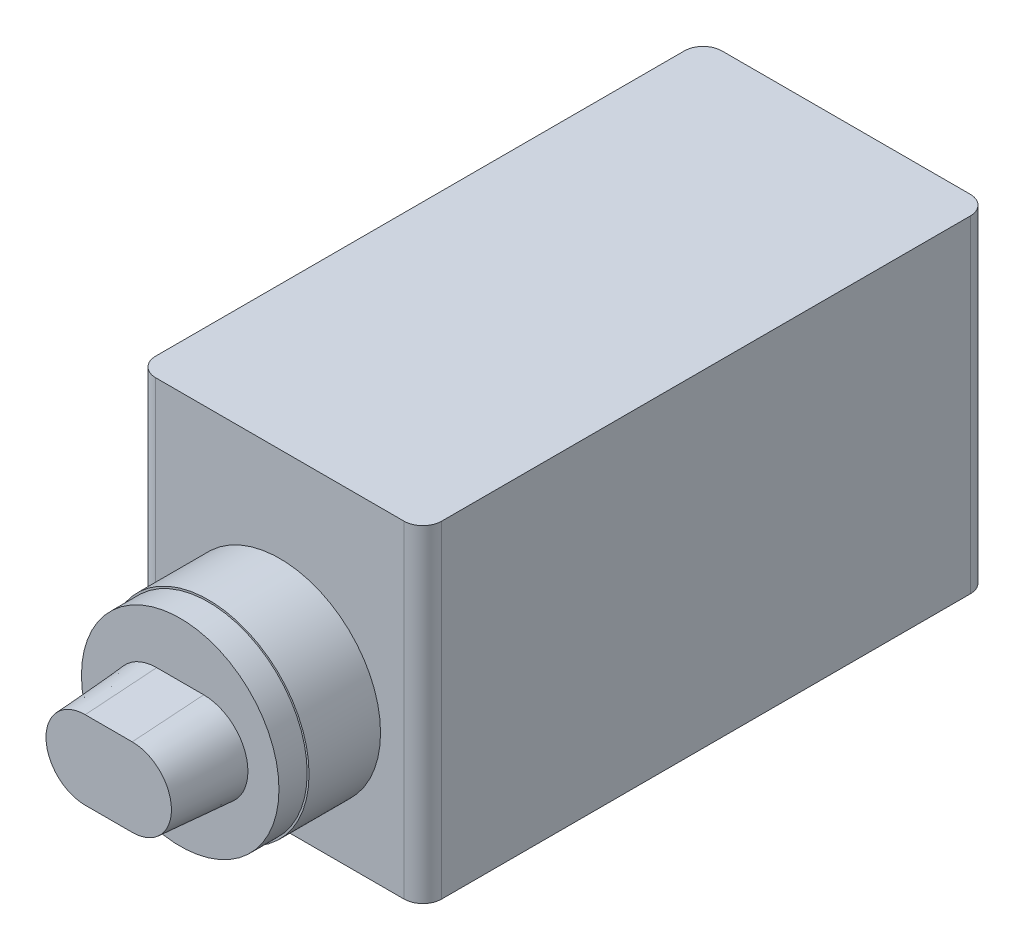
ISO-10303-21;
HEADER;
FILE_DESCRIPTION(('STEP AP214'),'2;1');
FILE_NAME('part.step','',(''),(''),'','','');
FILE_SCHEMA(('AUTOMOTIVE_DESIGN { 1 0 10303 214 1 1 1 1 }'));
ENDSEC;
DATA;
#1=APPLICATION_CONTEXT('core data for automotive mechanical design processes');
#2=APPLICATION_PROTOCOL_DEFINITION('international standard','automotive_design',2000,#1);
#3=PRODUCT_CONTEXT('',#1,'mechanical');
#4=PRODUCT('Part','Part','',(#3));
#5=PRODUCT_RELATED_PRODUCT_CATEGORY('part','',(#4));
#6=PRODUCT_DEFINITION_FORMATION('','',#4);
#7=PRODUCT_DEFINITION_CONTEXT('part definition',#1,'design');
#8=PRODUCT_DEFINITION('design','',#6,#7);
#9=PRODUCT_DEFINITION_SHAPE('','',#8);
#10=(LENGTH_UNIT() NAMED_UNIT(*) SI_UNIT(.MILLI.,.METRE.));
#11=(NAMED_UNIT(*) PLANE_ANGLE_UNIT() SI_UNIT($,.RADIAN.));
#12=(NAMED_UNIT(*) SI_UNIT($,.STERADIAN.) SOLID_ANGLE_UNIT());
#13=UNCERTAINTY_MEASURE_WITH_UNIT(LENGTH_MEASURE(1.E-05),#10,'distance_accuracy_value','');
#14=(GEOMETRIC_REPRESENTATION_CONTEXT(3) GLOBAL_UNCERTAINTY_ASSIGNED_CONTEXT((#13)) GLOBAL_UNIT_ASSIGNED_CONTEXT((#10,
#11,#12)) REPRESENTATION_CONTEXT('',''));
#15=CARTESIAN_POINT('',(0.,0.,0.));
#16=DIRECTION('',(0.,0.,1.));
#17=DIRECTION('',(1.,0.,0.));
#18=AXIS2_PLACEMENT_3D('',#15,#16,#17);
#19=CARTESIAN_POINT('',(0.,7.03074551830696,20.35));
#20=DIRECTION('',(0.,0.,1.));
#21=DIRECTION('',(1.,0.,0.));
#22=AXIS2_PLACEMENT_3D('',#19,#20,#21);
#23=PLANE('',#22);
#24=CARTESIAN_POINT('',(0.,7.03074551830696,20.35));
#25=DIRECTION('',(0.,0.,1.));
#26=DIRECTION('',(1.,0.,0.));
#27=AXIS2_PLACEMENT_3D('',#24,#25,#26);
#28=CIRCLE('',#27,5.25);
#29=CARTESIAN_POINT('',(5.25,7.03074551830696,20.35));
#30=VERTEX_POINT('',#29);
#31=EDGE_CURVE('E169',#30,#30,#28,.T.);
#32=ORIENTED_EDGE('',*,*,#31,.T.);
#33=EDGE_LOOP('',(#32));
#34=FACE_BOUND('',#33,.T.);
#35=DIRECTION('',(1.,0.,0.));
#36=VECTOR('',#35,1.);
#37=CARTESIAN_POINT('',(-1.25,4.68074551830696,20.35));
#38=LINE('',#37,#36);
#39=CARTESIAN_POINT('',(-1.25,4.68074551830696,20.35));
#40=VERTEX_POINT('',#39);
#41=CARTESIAN_POINT('',(1.25,4.68074551830696,20.35));
#42=VERTEX_POINT('',#41);
#43=EDGE_CURVE('E134',#40,#42,#38,.T.);
#44=ORIENTED_EDGE('',*,*,#43,.F.);
#45=CARTESIAN_POINT('',(-1.25,7.03074551830696,20.35));
#46=DIRECTION('',(0.,0.,1.));
#47=DIRECTION('',(1.,0.,0.));
#48=AXIS2_PLACEMENT_3D('',#45,#46,#47);
#49=CIRCLE('',#48,2.35);
#50=CARTESIAN_POINT('',(-1.25,9.38074551830696,20.35));
#51=VERTEX_POINT('',#50);
#52=EDGE_CURVE('E145',#51,#40,#49,.T.);
#53=ORIENTED_EDGE('',*,*,#52,.F.);
#54=DIRECTION('',(-1.,0.,0.));
#55=VECTOR('',#54,1.);
#56=CARTESIAN_POINT('',(-1.25,9.38074551830696,20.35));
#57=LINE('',#56,#55);
#58=CARTESIAN_POINT('',(1.25,9.38074551830696,20.35));
#59=VERTEX_POINT('',#58);
#60=EDGE_CURVE('E155',#59,#51,#57,.T.);
#61=ORIENTED_EDGE('',*,*,#60,.F.);
#62=CARTESIAN_POINT('',(1.25,7.03074551830696,20.35));
#63=DIRECTION('',(0.,0.,1.));
#64=DIRECTION('',(1.,0.,0.));
#65=AXIS2_PLACEMENT_3D('',#62,#63,#64);
#66=CIRCLE('',#65,2.35);
#67=EDGE_CURVE('E153',#42,#59,#66,.T.);
#68=ORIENTED_EDGE('',*,*,#67,.F.);
#69=EDGE_LOOP('',(#44,#53,#61,#68));
#70=FACE_BOUND('',#69,.T.);
#71=ADVANCED_FACE('F38',(#34,#70),#23,.T.);
#72=CARTESIAN_POINT('',(0.,7.03074551830696,18.85));
#73=DIRECTION('',(0.,0.,1.));
#74=DIRECTION('',(1.,0.,0.));
#75=AXIS2_PLACEMENT_3D('',#72,#73,#74);
#76=PLANE('',#75);
#77=CARTESIAN_POINT('',(0.,7.03074551830696,18.85));
#78=DIRECTION('',(0.,0.,1.));
#79=DIRECTION('',(1.,0.,0.));
#80=AXIS2_PLACEMENT_3D('',#77,#78,#79);
#81=CIRCLE('',#80,5.35);
#82=CARTESIAN_POINT('',(-5.35,7.03074551830696,18.85));
#83=VERTEX_POINT('',#82);
#84=EDGE_CURVE('E172',#83,#83,#81,.T.);
#85=ORIENTED_EDGE('',*,*,#84,.T.);
#86=EDGE_LOOP('',(#85));
#87=FACE_BOUND('',#86,.T.);
#88=CARTESIAN_POINT('',(0.,7.03074551830696,18.85));
#89=DIRECTION('',(0.,0.,1.));
#90=DIRECTION('',(1.,0.,0.));
#91=AXIS2_PLACEMENT_3D('',#88,#89,#90);
#92=CIRCLE('',#91,5.25);
#93=CARTESIAN_POINT('',(5.25,7.03074551830696,18.85));
#94=VERTEX_POINT('',#93);
#95=EDGE_CURVE('E140',#94,#94,#92,.T.);
#96=ORIENTED_EDGE('',*,*,#95,.F.);
#97=EDGE_LOOP('',(#96));
#98=FACE_BOUND('',#97,.T.);
#99=ADVANCED_FACE('F276',(#87,#98),#76,.T.);
#100=CARTESIAN_POINT('',(7.6,17.4,15.05));
#101=DIRECTION('',(0.,0.,-1.));
#102=DIRECTION('',(-1.,0.,0.));
#103=AXIS2_PLACEMENT_3D('',#100,#101,#102);
#104=PLANE('',#103);
#105=DIRECTION('',(1.,0.,0.));
#106=VECTOR('',#105,1.);
#107=CARTESIAN_POINT('',(7.6,17.4,15.05));
#108=LINE('',#107,#106);
#109=CARTESIAN_POINT('',(-6.6,17.4,15.05));
#110=VERTEX_POINT('',#109);
#111=CARTESIAN_POINT('',(6.6,17.4,15.05));
#112=VERTEX_POINT('',#111);
#113=EDGE_CURVE('E181',#110,#112,#108,.T.);
#114=ORIENTED_EDGE('',*,*,#113,.F.);
#115=DIRECTION('',(0.,-1.,0.));
#116=VECTOR('',#115,1.);
#117=CARTESIAN_POINT('',(-6.6,17.4,15.05));
#118=LINE('',#117,#116);
#119=CARTESIAN_POINT('',(-6.6,0.,15.05));
#120=VERTEX_POINT('',#119);
#121=EDGE_CURVE('E46',#110,#120,#118,.T.);
#122=ORIENTED_EDGE('',*,*,#121,.T.);
#123=DIRECTION('',(1.,0.,0.));
#124=VECTOR('',#123,1.);
#125=CARTESIAN_POINT('',(7.6,0.,15.05));
#126=LINE('',#125,#124);
#127=CARTESIAN_POINT('',(6.6,0.,15.05));
#128=VERTEX_POINT('',#127);
#129=EDGE_CURVE('E193',#120,#128,#126,.T.);
#130=ORIENTED_EDGE('',*,*,#129,.T.);
#131=DIRECTION('',(0.,-1.,0.));
#132=VECTOR('',#131,1.);
#133=CARTESIAN_POINT('',(6.6,17.4,15.05));
#134=LINE('',#133,#132);
#135=EDGE_CURVE('E229',#128,#112,#134,.F.);
#136=ORIENTED_EDGE('',*,*,#135,.T.);
#137=EDGE_LOOP('',(#114,#122,#130,#136));
#138=FACE_BOUND('',#137,.T.);
#139=CARTESIAN_POINT('',(0.,7.03074551830696,15.05));
#140=DIRECTION('',(0.,0.,-1.));
#141=DIRECTION('',(-1.,0.,0.));
#142=AXIS2_PLACEMENT_3D('',#139,#140,#141);
#143=CIRCLE('',#142,5.35);
#144=CARTESIAN_POINT('',(-5.35,7.03074551830696,15.05));
#145=VERTEX_POINT('',#144);
#146=EDGE_CURVE('E11',#145,#145,#143,.F.);
#147=ORIENTED_EDGE('',*,*,#146,.F.);
#148=EDGE_LOOP('',(#147));
#149=FACE_BOUND('',#148,.T.);
#150=ADVANCED_FACE('F235',(#138,#149),#104,.F.);
#151=CARTESIAN_POINT('',(-7.6,17.4,15.05));
#152=DIRECTION('',(1.,0.,0.));
#153=DIRECTION('',(0.,0.,-1.));
#154=AXIS2_PLACEMENT_3D('',#151,#152,#153);
#155=PLANE('',#154);
#156=DIRECTION('',(0.,0.,1.));
#157=VECTOR('',#156,1.);
#158=CARTESIAN_POINT('',(-7.6,17.4,15.05));
#159=LINE('',#158,#157);
#160=CARTESIAN_POINT('',(-7.6,17.4,-14.05));
#161=VERTEX_POINT('',#160);
#162=CARTESIAN_POINT('',(-7.6,17.4,14.05));
#163=VERTEX_POINT('',#162);
#164=EDGE_CURVE('E178',#161,#163,#159,.T.);
#165=ORIENTED_EDGE('',*,*,#164,.F.);
#166=DIRECTION('',(0.,-1.,0.));
#167=VECTOR('',#166,1.);
#168=CARTESIAN_POINT('',(-7.6,17.4,-14.05));
#169=LINE('',#168,#167);
#170=CARTESIAN_POINT('',(-7.6,0.,-14.05));
#171=VERTEX_POINT('',#170);
#172=EDGE_CURVE('E201',#161,#171,#169,.T.);
#173=ORIENTED_EDGE('',*,*,#172,.T.);
#174=DIRECTION('',(0.,0.,1.));
#175=VECTOR('',#174,1.);
#176=CARTESIAN_POINT('',(-7.6,0.,15.05));
#177=LINE('',#176,#175);
#178=CARTESIAN_POINT('',(-7.6,0.,14.05));
#179=VERTEX_POINT('',#178);
#180=EDGE_CURVE('E177',#171,#179,#177,.T.);
#181=ORIENTED_EDGE('',*,*,#180,.T.);
#182=DIRECTION('',(0.,-1.,0.));
#183=VECTOR('',#182,1.);
#184=CARTESIAN_POINT('',(-7.6,17.4,14.05));
#185=LINE('',#184,#183);
#186=EDGE_CURVE('E190',#179,#163,#185,.F.);
#187=ORIENTED_EDGE('',*,*,#186,.T.);
#188=EDGE_LOOP('',(#165,#173,#181,#187));
#189=FACE_BOUND('',#188,.T.);
#190=ADVANCED_FACE('F265',(#189),#155,.F.);
#191=CARTESIAN_POINT('',(7.6,17.4,15.05));
#192=DIRECTION('',(-1.,0.,0.));
#193=DIRECTION('',(0.,0.,1.));
#194=AXIS2_PLACEMENT_3D('',#191,#192,#193);
#195=PLANE('',#194);
#196=DIRECTION('',(0.,0.,-1.));
#197=VECTOR('',#196,1.);
#198=CARTESIAN_POINT('',(7.6,0.,15.05));
#199=LINE('',#198,#197);
#200=CARTESIAN_POINT('',(7.6,0.,14.05));
#201=VERTEX_POINT('',#200);
#202=CARTESIAN_POINT('',(7.6,0.,-14.05));
#203=VERTEX_POINT('',#202);
#204=EDGE_CURVE('E196',#201,#203,#199,.T.);
#205=ORIENTED_EDGE('',*,*,#204,.T.);
#206=DIRECTION('',(0.,-1.,0.));
#207=VECTOR('',#206,1.);
#208=CARTESIAN_POINT('',(7.6,17.4,-14.05));
#209=LINE('',#208,#207);
#210=CARTESIAN_POINT('',(7.6,17.4,-14.05));
#211=VERTEX_POINT('',#210);
#212=EDGE_CURVE('E61',#203,#211,#209,.F.);
#213=ORIENTED_EDGE('',*,*,#212,.T.);
#214=DIRECTION('',(0.,0.,-1.));
#215=VECTOR('',#214,1.);
#216=CARTESIAN_POINT('',(7.6,17.4,15.05));
#217=LINE('',#216,#215);
#218=CARTESIAN_POINT('',(7.6,17.4,14.05));
#219=VERTEX_POINT('',#218);
#220=EDGE_CURVE('E185',#219,#211,#217,.T.);
#221=ORIENTED_EDGE('',*,*,#220,.F.);
#222=DIRECTION('',(0.,-1.,0.));
#223=VECTOR('',#222,1.);
#224=CARTESIAN_POINT('',(7.6,17.4,14.05));
#225=LINE('',#224,#223);
#226=EDGE_CURVE('E225',#219,#201,#225,.T.);
#227=ORIENTED_EDGE('',*,*,#226,.T.);
#228=EDGE_LOOP('',(#205,#213,#221,#227));
#229=FACE_BOUND('',#228,.T.);
#230=ADVANCED_FACE('F247',(#229),#195,.F.);
#231=CARTESIAN_POINT('',(7.6,17.4,-15.05));
#232=DIRECTION('',(0.,0.,1.));
#233=DIRECTION('',(1.,0.,0.));
#234=AXIS2_PLACEMENT_3D('',#231,#232,#233);
#235=PLANE('',#234);
#236=DIRECTION('',(-1.,0.,0.));
#237=VECTOR('',#236,1.);
#238=CARTESIAN_POINT('',(7.6,0.,-15.05));
#239=LINE('',#238,#237);
#240=CARTESIAN_POINT('',(6.6,0.,-15.05));
#241=VERTEX_POINT('',#240);
#242=CARTESIAN_POINT('',(-6.6,0.,-15.05));
#243=VERTEX_POINT('',#242);
#244=EDGE_CURVE('E182',#241,#243,#239,.T.);
#245=ORIENTED_EDGE('',*,*,#244,.T.);
#246=DIRECTION('',(0.,-1.,0.));
#247=VECTOR('',#246,1.);
#248=CARTESIAN_POINT('',(-6.6,17.4,-15.05));
#249=LINE('',#248,#247);
#250=CARTESIAN_POINT('',(-6.6,17.4,-15.05));
#251=VERTEX_POINT('',#250);
#252=EDGE_CURVE('E215',#243,#251,#249,.F.);
#253=ORIENTED_EDGE('',*,*,#252,.T.);
#254=DIRECTION('',(-1.,0.,0.));
#255=VECTOR('',#254,1.);
#256=CARTESIAN_POINT('',(7.6,17.4,-15.05));
#257=LINE('',#256,#255);
#258=CARTESIAN_POINT('',(6.6,17.4,-15.05));
#259=VERTEX_POINT('',#258);
#260=EDGE_CURVE('E187',#259,#251,#257,.T.);
#261=ORIENTED_EDGE('',*,*,#260,.F.);
#262=DIRECTION('',(0.,-1.,0.));
#263=VECTOR('',#262,1.);
#264=CARTESIAN_POINT('',(6.6,17.4,-15.05));
#265=LINE('',#264,#263);
#266=EDGE_CURVE('E212',#259,#241,#265,.T.);
#267=ORIENTED_EDGE('',*,*,#266,.T.);
#268=EDGE_LOOP('',(#245,#253,#261,#267));
#269=FACE_BOUND('',#268,.T.);
#270=ADVANCED_FACE('F257',(#269),#235,.F.);
#271=CARTESIAN_POINT('',(-7.6,17.4,-15.05));
#272=DIRECTION('',(0.,1.,0.));
#273=DIRECTION('',(0.,0.,1.));
#274=AXIS2_PLACEMENT_3D('',#271,#272,#273);
#275=PLANE('',#274);
#276=ORIENTED_EDGE('',*,*,#260,.T.);
#277=CARTESIAN_POINT('',(-6.6,17.4,-14.05));
#278=DIRECTION('',(0.,1.,0.));
#279=DIRECTION('',(0.,0.,1.));
#280=AXIS2_PLACEMENT_3D('',#277,#278,#279);
#281=CIRCLE('',#280,1.);
#282=EDGE_CURVE('E223',#251,#161,#281,.T.);
#283=ORIENTED_EDGE('',*,*,#282,.T.);
#284=ORIENTED_EDGE('',*,*,#164,.T.);
#285=CARTESIAN_POINT('',(-6.6,17.4,14.05));
#286=DIRECTION('',(0.,1.,0.));
#287=DIRECTION('',(0.,0.,1.));
#288=AXIS2_PLACEMENT_3D('',#285,#286,#287);
#289=CIRCLE('',#288,1.);
#290=EDGE_CURVE('E219',#163,#110,#289,.T.);
#291=ORIENTED_EDGE('',*,*,#290,.T.);
#292=ORIENTED_EDGE('',*,*,#113,.T.);
#293=CARTESIAN_POINT('',(6.6,17.4,14.05));
#294=DIRECTION('',(0.,1.,0.));
#295=DIRECTION('',(0.,0.,1.));
#296=AXIS2_PLACEMENT_3D('',#293,#294,#295);
#297=CIRCLE('',#296,1.);
#298=EDGE_CURVE('E217',#112,#219,#297,.T.);
#299=ORIENTED_EDGE('',*,*,#298,.T.);
#300=ORIENTED_EDGE('',*,*,#220,.T.);
#301=CARTESIAN_POINT('',(6.6,17.4,-14.05));
#302=DIRECTION('',(0.,1.,0.));
#303=DIRECTION('',(0.,0.,1.));
#304=AXIS2_PLACEMENT_3D('',#301,#302,#303);
#305=CIRCLE('',#304,1.);
#306=EDGE_CURVE('E221',#211,#259,#305,.T.);
#307=ORIENTED_EDGE('',*,*,#306,.T.);
#308=EDGE_LOOP('',(#276,#283,#284,#291,#292,#299,#300,#307));
#309=FACE_BOUND('',#308,.T.);
#310=ADVANCED_FACE('F250',(#309),#275,.T.);
#311=CARTESIAN_POINT('',(-7.6,0.,-15.05));
#312=DIRECTION('',(0.,1.,0.));
#313=DIRECTION('',(0.,0.,1.));
#314=AXIS2_PLACEMENT_3D('',#311,#312,#313);
#315=PLANE('',#314);
#316=ORIENTED_EDGE('',*,*,#180,.F.);
#317=CARTESIAN_POINT('',(-6.6,0.,-14.05));
#318=DIRECTION('',(0.,1.,0.));
#319=DIRECTION('',(0.,0.,1.));
#320=AXIS2_PLACEMENT_3D('',#317,#318,#319);
#321=CIRCLE('',#320,1.);
#322=EDGE_CURVE('E210',#171,#243,#321,.F.);
#323=ORIENTED_EDGE('',*,*,#322,.T.);
#324=ORIENTED_EDGE('',*,*,#244,.F.);
#325=CARTESIAN_POINT('',(6.6,0.,-14.05));
#326=DIRECTION('',(0.,1.,0.));
#327=DIRECTION('',(0.,0.,1.));
#328=AXIS2_PLACEMENT_3D('',#325,#326,#327);
#329=CIRCLE('',#328,1.);
#330=EDGE_CURVE('E208',#241,#203,#329,.F.);
#331=ORIENTED_EDGE('',*,*,#330,.T.);
#332=ORIENTED_EDGE('',*,*,#204,.F.);
#333=CARTESIAN_POINT('',(6.6,0.,14.05));
#334=DIRECTION('',(0.,1.,0.));
#335=DIRECTION('',(0.,0.,1.));
#336=AXIS2_PLACEMENT_3D('',#333,#334,#335);
#337=CIRCLE('',#336,1.);
#338=EDGE_CURVE('E204',#201,#128,#337,.F.);
#339=ORIENTED_EDGE('',*,*,#338,.T.);
#340=ORIENTED_EDGE('',*,*,#129,.F.);
#341=CARTESIAN_POINT('',(-6.6,0.,14.05));
#342=DIRECTION('',(0.,1.,0.));
#343=DIRECTION('',(0.,0.,1.));
#344=AXIS2_PLACEMENT_3D('',#341,#342,#343);
#345=CIRCLE('',#344,1.);
#346=EDGE_CURVE('E206',#120,#179,#345,.F.);
#347=ORIENTED_EDGE('',*,*,#346,.T.);
#348=EDGE_LOOP('',(#316,#323,#324,#331,#332,#339,#340,#347));
#349=FACE_BOUND('',#348,.T.);
#350=ADVANCED_FACE('F242',(#349),#315,.F.);
#351=CARTESIAN_POINT('',(-6.6,17.4,-14.05));
#352=DIRECTION('',(0.,-1.,0.));
#353=DIRECTION('',(0.,0.,-1.));
#354=AXIS2_PLACEMENT_3D('',#351,#352,#353);
#355=CYLINDRICAL_SURFACE('',#354,1.);
#356=ORIENTED_EDGE('',*,*,#282,.F.);
#357=ORIENTED_EDGE('',*,*,#252,.F.);
#358=ORIENTED_EDGE('',*,*,#322,.F.);
#359=ORIENTED_EDGE('',*,*,#172,.F.);
#360=EDGE_LOOP('',(#356,#357,#358,#359));
#361=FACE_BOUND('',#360,.T.);
#362=ADVANCED_FACE('F262',(#361),#355,.T.);
#363=CARTESIAN_POINT('',(6.6,17.4,-14.05));
#364=DIRECTION('',(0.,-1.,0.));
#365=DIRECTION('',(0.,0.,-1.));
#366=AXIS2_PLACEMENT_3D('',#363,#364,#365);
#367=CYLINDRICAL_SURFACE('',#366,1.);
#368=ORIENTED_EDGE('',*,*,#306,.F.);
#369=ORIENTED_EDGE('',*,*,#212,.F.);
#370=ORIENTED_EDGE('',*,*,#330,.F.);
#371=ORIENTED_EDGE('',*,*,#266,.F.);
#372=EDGE_LOOP('',(#368,#369,#370,#371));
#373=FACE_BOUND('',#372,.T.);
#374=ADVANCED_FACE('F254',(#373),#367,.T.);
#375=CARTESIAN_POINT('',(-6.6,17.4,14.05));
#376=DIRECTION('',(0.,-1.,0.));
#377=DIRECTION('',(0.,0.,-1.));
#378=AXIS2_PLACEMENT_3D('',#375,#376,#377);
#379=CYLINDRICAL_SURFACE('',#378,1.);
#380=ORIENTED_EDGE('',*,*,#290,.F.);
#381=ORIENTED_EDGE('',*,*,#186,.F.);
#382=ORIENTED_EDGE('',*,*,#346,.F.);
#383=ORIENTED_EDGE('',*,*,#121,.F.);
#384=EDGE_LOOP('',(#380,#381,#382,#383));
#385=FACE_BOUND('',#384,.T.);
#386=ADVANCED_FACE('F267',(#385),#379,.T.);
#387=CARTESIAN_POINT('',(6.6,17.4,14.05));
#388=DIRECTION('',(0.,-1.,0.));
#389=DIRECTION('',(0.,0.,-1.));
#390=AXIS2_PLACEMENT_3D('',#387,#388,#389);
#391=CYLINDRICAL_SURFACE('',#390,1.);
#392=ORIENTED_EDGE('',*,*,#298,.F.);
#393=ORIENTED_EDGE('',*,*,#135,.F.);
#394=ORIENTED_EDGE('',*,*,#338,.F.);
#395=ORIENTED_EDGE('',*,*,#226,.F.);
#396=EDGE_LOOP('',(#392,#393,#394,#395));
#397=FACE_BOUND('',#396,.T.);
#398=ADVANCED_FACE('F40',(#397),#391,.T.);
#399=CARTESIAN_POINT('',(0.,7.03074551830696,18.85));
#400=DIRECTION('',(0.,0.,-1.));
#401=DIRECTION('',(-1.,0.,0.));
#402=AXIS2_PLACEMENT_3D('',#399,#400,#401);
#403=CYLINDRICAL_SURFACE('',#402,5.35);
#404=CARTESIAN_POINT('',(-5.35,7.03074551830696,18.85));
#405=CARTESIAN_POINT('',(-5.35,7.03074551830696,18.8104166666667));
#406=CARTESIAN_POINT('',(-5.35,7.03074551830696,18.7708333333333));
#407=CARTESIAN_POINT('',(-5.35,7.03074551830696,18.6916666666667));
#408=CARTESIAN_POINT('',(-5.35,7.03074551830696,18.6520833333333));
#409=CARTESIAN_POINT('',(-5.35,7.03074551830696,18.5729166666667));
#410=CARTESIAN_POINT('',(-5.35,7.03074551830696,18.5333333333333));
#411=CARTESIAN_POINT('',(-5.35,7.03074551830696,18.4541666666667));
#412=CARTESIAN_POINT('',(-5.35,7.03074551830696,18.4145833333333));
#413=CARTESIAN_POINT('',(-5.35,7.03074551830696,18.3354166666667));
#414=CARTESIAN_POINT('',(-5.35,7.03074551830696,18.2958333333333));
#415=CARTESIAN_POINT('',(-5.35,7.03074551830696,18.2166666666667));
#416=CARTESIAN_POINT('',(-5.35,7.03074551830696,18.1770833333333));
#417=CARTESIAN_POINT('',(-5.35,7.03074551830696,18.0979166666667));
#418=CARTESIAN_POINT('',(-5.35,7.03074551830696,18.0583333333333));
#419=CARTESIAN_POINT('',(-5.35,7.03074551830696,17.9791666666667));
#420=CARTESIAN_POINT('',(-5.35,7.03074551830696,17.9395833333333));
#421=CARTESIAN_POINT('',(-5.35,7.03074551830696,17.8604166666667));
#422=CARTESIAN_POINT('',(-5.35,7.03074551830696,17.8208333333333));
#423=CARTESIAN_POINT('',(-5.35,7.03074551830696,17.7416666666667));
#424=CARTESIAN_POINT('',(-5.35,7.03074551830696,17.7020833333333));
#425=CARTESIAN_POINT('',(-5.35,7.03074551830696,17.6229166666667));
#426=CARTESIAN_POINT('',(-5.35,7.03074551830696,17.5833333333333));
#427=CARTESIAN_POINT('',(-5.35,7.03074551830696,17.5041666666667));
#428=CARTESIAN_POINT('',(-5.35,7.03074551830696,17.4645833333333));
#429=CARTESIAN_POINT('',(-5.35,7.03074551830696,17.3854166666667));
#430=CARTESIAN_POINT('',(-5.35,7.03074551830696,17.3458333333333));
#431=CARTESIAN_POINT('',(-5.35,7.03074551830696,17.2666666666667));
#432=CARTESIAN_POINT('',(-5.35,7.03074551830696,17.2270833333333));
#433=CARTESIAN_POINT('',(-5.35,7.03074551830696,17.1479166666667));
#434=CARTESIAN_POINT('',(-5.35,7.03074551830696,17.1083333333333));
#435=CARTESIAN_POINT('',(-5.35,7.03074551830696,17.0291666666667));
#436=CARTESIAN_POINT('',(-5.35,7.03074551830696,16.9895833333333));
#437=CARTESIAN_POINT('',(-5.35,7.03074551830696,16.9104166666667));
#438=CARTESIAN_POINT('',(-5.35,7.03074551830696,16.8708333333333));
#439=CARTESIAN_POINT('',(-5.35,7.03074551830696,16.7916666666667));
#440=CARTESIAN_POINT('',(-5.35,7.03074551830696,16.7520833333333));
#441=CARTESIAN_POINT('',(-5.35,7.03074551830696,16.6729166666667));
#442=CARTESIAN_POINT('',(-5.35,7.03074551830696,16.6333333333333));
#443=CARTESIAN_POINT('',(-5.35,7.03074551830696,16.5541666666667));
#444=CARTESIAN_POINT('',(-5.35,7.03074551830696,16.5145833333333));
#445=CARTESIAN_POINT('',(-5.35,7.03074551830696,16.4354166666667));
#446=CARTESIAN_POINT('',(-5.35,7.03074551830696,16.3958333333333));
#447=CARTESIAN_POINT('',(-5.35,7.03074551830696,16.3166666666667));
#448=CARTESIAN_POINT('',(-5.35,7.03074551830696,16.2770833333333));
#449=CARTESIAN_POINT('',(-5.35,7.03074551830696,16.1979166666667));
#450=CARTESIAN_POINT('',(-5.35,7.03074551830696,16.1583333333333));
#451=CARTESIAN_POINT('',(-5.35,7.03074551830696,16.0791666666667));
#452=CARTESIAN_POINT('',(-5.35,7.03074551830696,16.0395833333333));
#453=CARTESIAN_POINT('',(-5.35,7.03074551830696,15.9604166666667));
#454=CARTESIAN_POINT('',(-5.35,7.03074551830696,15.9208333333333));
#455=CARTESIAN_POINT('',(-5.35,7.03074551830696,15.8416666666667));
#456=CARTESIAN_POINT('',(-5.35,7.03074551830696,15.8020833333333));
#457=CARTESIAN_POINT('',(-5.35,7.03074551830696,15.7229166666667));
#458=CARTESIAN_POINT('',(-5.35,7.03074551830696,15.6833333333333));
#459=CARTESIAN_POINT('',(-5.35,7.03074551830696,15.6041666666667));
#460=CARTESIAN_POINT('',(-5.35,7.03074551830696,15.5645833333333));
#461=CARTESIAN_POINT('',(-5.35,7.03074551830696,15.4854166666667));
#462=CARTESIAN_POINT('',(-5.35,7.03074551830696,15.4458333333333));
#463=CARTESIAN_POINT('',(-5.35,7.03074551830696,15.3666666666667));
#464=CARTESIAN_POINT('',(-5.35,7.03074551830696,15.3270833333333));
#465=CARTESIAN_POINT('',(-5.35,7.03074551830696,15.2479166666667));
#466=CARTESIAN_POINT('',(-5.35,7.03074551830696,15.2083333333333));
#467=CARTESIAN_POINT('',(-5.35,7.03074551830696,15.1291666666667));
#468=CARTESIAN_POINT('',(-5.35,7.03074551830696,15.0895833333333));
#469=CARTESIAN_POINT('',(-5.35,7.03074551830696,15.05));
#470=B_SPLINE_CURVE_WITH_KNOTS('',3,(#404,#405,#406,#407,#408,#409,#410,#411,#412,#413,#414,
#415,#416,#417,#418,#419,#420,#421,#422,#423,#424,#425,#426,#427,#428,#429,#430,#431,#432,#433,
#434,#435,#436,#437,#438,#439,#440,#441,#442,#443,#444,#445,#446,#447,#448,#449,#450,#451,#452,
#453,#454,#455,#456,#457,#458,#459,#460,#461,#462,#463,#464,#465,#466,#467,#468,#469),
.UNSPECIFIED.,.F.,.F.,(4,2,2,2,2,2,2,2,2,2,2,2,2,2,2,2,2,2,2,2,2,2,2,2,2,2,2,2,2,2,2,2,4),(0.,
0.118750000000001,0.237500000000002,0.356250000000002,0.475000000000003,0.593750000000001,
0.712500000000001,0.831250000000002,0.950000000000003,1.06875,1.1875,1.30625,1.425,1.54375,
1.6625,1.78125,1.9,2.01875,2.1375,2.25625,2.375,2.49375,2.6125,2.73125,2.85,2.96875,3.0875,
3.20625,3.325,3.44375,3.5625,3.68125,3.8),.UNSPECIFIED.);
#471=EDGE_CURVE('BSEAM273',#83,#145,#470,.T.);
#472=ORIENTED_EDGE('',*,*,#84,.F.);
#473=ORIENTED_EDGE('',*,*,#146,.T.);
#474=ORIENTED_EDGE('',*,*,#471,.T.);
#475=ORIENTED_EDGE('',*,*,#471,.F.);
#476=EDGE_LOOP('',(#472,#474,#473,#475));
#477=FACE_BOUND('',#476,.T.);
#478=ADVANCED_FACE('F273',(#477),#403,.T.);
#479=CARTESIAN_POINT('',(0.,7.03074551830696,20.35));
#480=DIRECTION('',(0.,0.,-1.));
#481=DIRECTION('',(-1.,0.,0.));
#482=AXIS2_PLACEMENT_3D('',#479,#480,#481);
#483=CYLINDRICAL_SURFACE('',#482,5.25);
#484=ORIENTED_EDGE('',*,*,#31,.F.);
#485=EDGE_LOOP('',(#484));
#486=FACE_BOUND('',#485,.T.);
#487=ORIENTED_EDGE('',*,*,#95,.T.);
#488=EDGE_LOOP('',(#487));
#489=FACE_BOUND('',#488,.T.);
#490=ADVANCED_FACE('F287',(#486,#489),#483,.T.);
#491=CARTESIAN_POINT('',(-1.25,7.03074551830696,20.35));
#492=DIRECTION('',(0.,0.,-1.));
#493=DIRECTION('',(1.,0.,0.));
#494=AXIS2_PLACEMENT_3D('',#491,#492,#493);
#495=CONICAL_SURFACE('',#494,2.35,0.0698131700797733);
#496=ORIENTED_EDGE('',*,*,#52,.T.);
#497=DIRECTION('',(0.,-0.0697564737441255,-0.997564050259824));
#498=VECTOR('',#497,1.);
#499=CARTESIAN_POINT('',(-1.25,4.68074551830696,20.35));
#500=LINE('',#499,#498);
#501=CARTESIAN_POINT('',(-1.25,4.9464674036923,24.15));
#502=VERTEX_POINT('',#501);
#503=EDGE_CURVE('E129',#502,#40,#500,.T.);
#504=ORIENTED_EDGE('',*,*,#503,.F.);
#505=CARTESIAN_POINT('',(-1.25,7.03074551830696,24.15));
#506=DIRECTION('',(0.,0.,1.));
#507=DIRECTION('',(1.,0.,0.));
#508=AXIS2_PLACEMENT_3D('',#505,#506,#507);
#509=CIRCLE('',#508,2.08427811461466);
#510=CARTESIAN_POINT('',(-1.25,9.11502363292162,24.15));
#511=VERTEX_POINT('',#510);
#512=EDGE_CURVE('E158',#511,#502,#509,.T.);
#513=ORIENTED_EDGE('',*,*,#512,.F.);
#514=DIRECTION('',(0.,0.0697564737441255,-0.997564050259824));
#515=VECTOR('',#514,1.);
#516=CARTESIAN_POINT('',(-1.25,9.38074551830696,20.35));
#517=LINE('',#516,#515);
#518=EDGE_CURVE('E148',#511,#51,#517,.T.);
#519=ORIENTED_EDGE('',*,*,#518,.T.);
#520=EDGE_LOOP('',(#496,#504,#513,#519));
#521=FACE_BOUND('',#520,.T.);
#522=ADVANCED_FACE('F146',(#521),#495,.T.);
#523=CARTESIAN_POINT('',(-1.25,4.68074551830696,20.35));
#524=DIRECTION('',(0.,-0.997564050259824,0.0697564737441255));
#525=DIRECTION('',(0.,-0.0697564737441255,-0.997564050259824));
#526=AXIS2_PLACEMENT_3D('',#523,#524,#525);
#527=PLANE('',#526);
#528=ORIENTED_EDGE('',*,*,#43,.T.);
#529=DIRECTION('',(0.,-0.0697564737441255,-0.997564050259824));
#530=VECTOR('',#529,1.);
#531=CARTESIAN_POINT('',(1.25,4.68074551830696,20.35));
#532=LINE('',#531,#530);
#533=CARTESIAN_POINT('',(1.25,4.9464674036923,24.15));
#534=VERTEX_POINT('',#533);
#535=EDGE_CURVE('E141',#534,#42,#532,.T.);
#536=ORIENTED_EDGE('',*,*,#535,.F.);
#537=DIRECTION('',(-1.,0.,0.));
#538=VECTOR('',#537,1.);
#539=CARTESIAN_POINT('',(-1.25,4.9464674036923,24.15));
#540=LINE('',#539,#538);
#541=EDGE_CURVE('E136',#502,#534,#540,.F.);
#542=ORIENTED_EDGE('',*,*,#541,.F.);
#543=ORIENTED_EDGE('',*,*,#503,.T.);
#544=EDGE_LOOP('',(#528,#536,#542,#543));
#545=FACE_BOUND('',#544,.T.);
#546=ADVANCED_FACE('F131',(#545),#527,.T.);
#547=CARTESIAN_POINT('',(1.25,7.03074551830696,20.35));
#548=DIRECTION('',(0.,0.,-1.));
#549=DIRECTION('',(1.,0.,0.));
#550=AXIS2_PLACEMENT_3D('',#547,#548,#549);
#551=CONICAL_SURFACE('',#550,2.35,0.0698131700797733);
#552=ORIENTED_EDGE('',*,*,#67,.T.);
#553=DIRECTION('',(0.,0.0697564737441255,-0.997564050259824));
#554=VECTOR('',#553,1.);
#555=CARTESIAN_POINT('',(1.25,9.38074551830696,20.35));
#556=LINE('',#555,#554);
#557=CARTESIAN_POINT('',(1.25,9.11502363292162,24.15));
#558=VERTEX_POINT('',#557);
#559=EDGE_CURVE('E53',#558,#59,#556,.T.);
#560=ORIENTED_EDGE('',*,*,#559,.F.);
#561=CARTESIAN_POINT('',(1.25,7.03074551830696,24.15));
#562=DIRECTION('',(0.,0.,1.));
#563=DIRECTION('',(1.,0.,0.));
#564=AXIS2_PLACEMENT_3D('',#561,#562,#563);
#565=CIRCLE('',#564,2.08427811461466);
#566=EDGE_CURVE('E166',#534,#558,#565,.T.);
#567=ORIENTED_EDGE('',*,*,#566,.F.);
#568=ORIENTED_EDGE('',*,*,#535,.T.);
#569=EDGE_LOOP('',(#552,#560,#567,#568));
#570=FACE_BOUND('',#569,.T.);
#571=ADVANCED_FACE('F370',(#570),#551,.T.);
#572=CARTESIAN_POINT('',(-1.25,9.38074551830696,20.35));
#573=DIRECTION('',(0.,0.997564050259824,0.0697564737441255));
#574=DIRECTION('',(0.,-0.0697564737441255,0.997564050259824));
#575=AXIS2_PLACEMENT_3D('',#572,#573,#574);
#576=PLANE('',#575);
#577=ORIENTED_EDGE('',*,*,#60,.T.);
#578=ORIENTED_EDGE('',*,*,#518,.F.);
#579=DIRECTION('',(1.,0.,0.));
#580=VECTOR('',#579,1.);
#581=CARTESIAN_POINT('',(-1.25,9.11502363292162,24.15));
#582=LINE('',#581,#580);
#583=EDGE_CURVE('E161',#558,#511,#582,.F.);
#584=ORIENTED_EDGE('',*,*,#583,.F.);
#585=ORIENTED_EDGE('',*,*,#559,.T.);
#586=EDGE_LOOP('',(#577,#578,#584,#585));
#587=FACE_BOUND('',#586,.T.);
#588=ADVANCED_FACE('F378',(#587),#576,.T.);
#589=CARTESIAN_POINT('',(-1.25,7.03074551830696,24.15));
#590=DIRECTION('',(0.,0.,1.));
#591=DIRECTION('',(1.,0.,0.));
#592=AXIS2_PLACEMENT_3D('',#589,#590,#591);
#593=PLANE('',#592);
#594=ORIENTED_EDGE('',*,*,#512,.T.);
#595=ORIENTED_EDGE('',*,*,#541,.T.);
#596=ORIENTED_EDGE('',*,*,#566,.T.);
#597=ORIENTED_EDGE('',*,*,#583,.T.);
#598=EDGE_LOOP('',(#594,#595,#596,#597));
#599=FACE_BOUND('',#598,.T.);
#600=ADVANCED_FACE('F387',(#599),#593,.T.);
#601=CLOSED_SHELL('',(#71,#99,#150,#190,#230,#270,#310,#350,#362,#374,#386,#398,#478,#490,#522,
#546,#571,#588,#600));
#602=MANIFOLD_SOLID_BREP('B2',#601);
#603=ADVANCED_BREP_SHAPE_REPRESENTATION('',(#18,#602),#14);
#604=SHAPE_DEFINITION_REPRESENTATION(#9,#603);
ENDSEC;
END-ISO-10303-21;
